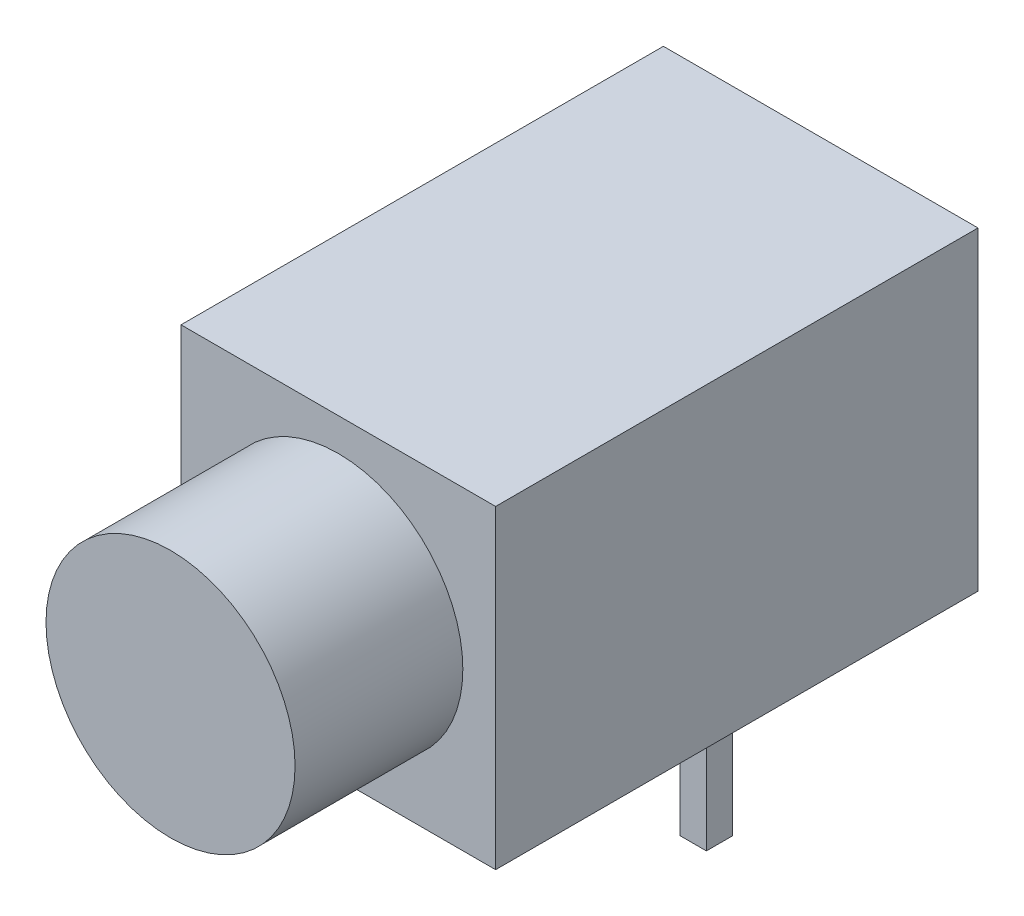
ISO-10303-21;
HEADER;
FILE_DESCRIPTION(('STEP AP214'),'2;1');
FILE_NAME('part.step','',(''),(''),'','','');
FILE_SCHEMA(('AUTOMOTIVE_DESIGN { 1 0 10303 214 1 1 1 1 }'));
ENDSEC;
DATA;
#1=APPLICATION_CONTEXT('core data for automotive mechanical design processes');
#2=APPLICATION_PROTOCOL_DEFINITION('international standard','automotive_design',2000,#1);
#3=PRODUCT_CONTEXT('',#1,'mechanical');
#4=PRODUCT('Part','Part','',(#3));
#5=PRODUCT_RELATED_PRODUCT_CATEGORY('part','',(#4));
#6=PRODUCT_DEFINITION_FORMATION('','',#4);
#7=PRODUCT_DEFINITION_CONTEXT('part definition',#1,'design');
#8=PRODUCT_DEFINITION('design','',#6,#7);
#9=PRODUCT_DEFINITION_SHAPE('','',#8);
#10=(LENGTH_UNIT() NAMED_UNIT(*) SI_UNIT(.MILLI.,.METRE.));
#11=(NAMED_UNIT(*) PLANE_ANGLE_UNIT() SI_UNIT($,.RADIAN.));
#12=(NAMED_UNIT(*) SI_UNIT($,.STERADIAN.) SOLID_ANGLE_UNIT());
#13=UNCERTAINTY_MEASURE_WITH_UNIT(LENGTH_MEASURE(1.E-05),#10,'distance_accuracy_value','');
#14=(GEOMETRIC_REPRESENTATION_CONTEXT(3) GLOBAL_UNCERTAINTY_ASSIGNED_CONTEXT((#13)) GLOBAL_UNIT_ASSIGNED_CONTEXT((#10,
#11,#12)) REPRESENTATION_CONTEXT('',''));
#15=CARTESIAN_POINT('',(0.,0.,0.));
#16=DIRECTION('',(0.,0.,1.));
#17=DIRECTION('',(1.,0.,0.));
#18=AXIS2_PLACEMENT_3D('',#15,#16,#17);
#19=CARTESIAN_POINT('',(0.,0.,0.));
#20=DIRECTION('',(0.,1.,0.));
#21=DIRECTION('',(0.,0.,1.));
#22=AXIS2_PLACEMENT_3D('',#19,#20,#21);
#23=PLANE('',#22);
#24=DIRECTION('',(0.,0.,-1.));
#25=VECTOR('',#24,1.);
#26=CARTESIAN_POINT('',(1.48,0.,-6.));
#27=LINE('',#26,#25);
#28=CARTESIAN_POINT('',(1.48,0.,-5.5));
#29=VERTEX_POINT('',#28);
#30=CARTESIAN_POINT('',(1.48,0.,-6.));
#31=VERTEX_POINT('',#30);
#32=EDGE_CURVE('E130',#29,#31,#27,.T.);
#33=ORIENTED_EDGE('',*,*,#32,.F.);
#34=DIRECTION('',(-1.,0.,0.));
#35=VECTOR('',#34,1.);
#36=CARTESIAN_POINT('',(1.48,0.,-5.5));
#37=LINE('',#36,#35);
#38=CARTESIAN_POINT('',(1.98,0.,-5.5));
#39=VERTEX_POINT('',#38);
#40=EDGE_CURVE('E163',#39,#29,#37,.T.);
#41=ORIENTED_EDGE('',*,*,#40,.F.);
#42=DIRECTION('',(0.,0.,1.));
#43=VECTOR('',#42,1.);
#44=CARTESIAN_POINT('',(1.98,0.,-6.));
#45=LINE('',#44,#43);
#46=CARTESIAN_POINT('',(1.98,0.,-6.));
#47=VERTEX_POINT('',#46);
#48=EDGE_CURVE('E175',#47,#39,#45,.T.);
#49=ORIENTED_EDGE('',*,*,#48,.F.);
#50=DIRECTION('',(1.,0.,0.));
#51=VECTOR('',#50,1.);
#52=CARTESIAN_POINT('',(1.48,0.,-6.));
#53=LINE('',#52,#51);
#54=EDGE_CURVE('E172',#31,#47,#53,.T.);
#55=ORIENTED_EDGE('',*,*,#54,.F.);
#56=EDGE_LOOP('',(#33,#41,#49,#55));
#57=FACE_BOUND('',#56,.T.);
#58=DIRECTION('',(1.,0.,0.));
#59=VECTOR('',#58,1.);
#60=CARTESIAN_POINT('',(0.,0.,-9.2));
#61=LINE('',#60,#59);
#62=CARTESIAN_POINT('',(0.,0.,-9.2));
#63=VERTEX_POINT('',#62);
#64=CARTESIAN_POINT('',(6.,0.,-9.2));
#65=VERTEX_POINT('',#64);
#66=EDGE_CURVE('E193',#63,#65,#61,.T.);
#67=ORIENTED_EDGE('',*,*,#66,.T.);
#68=DIRECTION('',(0.,0.,-1.));
#69=VECTOR('',#68,1.);
#70=CARTESIAN_POINT('',(6.,0.,0.));
#71=LINE('',#70,#69);
#72=CARTESIAN_POINT('',(6.,0.,0.));
#73=VERTEX_POINT('',#72);
#74=EDGE_CURVE('E208',#73,#65,#71,.T.);
#75=ORIENTED_EDGE('',*,*,#74,.F.);
#76=DIRECTION('',(1.,0.,0.));
#77=VECTOR('',#76,1.);
#78=CARTESIAN_POINT('',(0.,0.,0.));
#79=LINE('',#78,#77);
#80=CARTESIAN_POINT('',(0.,0.,0.));
#81=VERTEX_POINT('',#80);
#82=EDGE_CURVE('E211',#81,#73,#79,.T.);
#83=ORIENTED_EDGE('',*,*,#82,.F.);
#84=DIRECTION('',(0.,0.,-1.));
#85=VECTOR('',#84,1.);
#86=CARTESIAN_POINT('',(0.,0.,0.));
#87=LINE('',#86,#85);
#88=EDGE_CURVE('E199',#81,#63,#87,.T.);
#89=ORIENTED_EDGE('',*,*,#88,.T.);
#90=EDGE_LOOP('',(#67,#75,#83,#89));
#91=FACE_BOUND('',#90,.T.);
#92=DIRECTION('',(0.,0.,-1.));
#93=VECTOR('',#92,1.);
#94=CARTESIAN_POINT('',(4.02,0.,-6.));
#95=LINE('',#94,#93);
#96=CARTESIAN_POINT('',(4.02,0.,-5.5));
#97=VERTEX_POINT('',#96);
#98=CARTESIAN_POINT('',(4.02,0.,-6.));
#99=VERTEX_POINT('',#98);
#100=EDGE_CURVE('E124',#97,#99,#95,.T.);
#101=ORIENTED_EDGE('',*,*,#100,.F.);
#102=DIRECTION('',(-1.,0.,0.));
#103=VECTOR('',#102,1.);
#104=CARTESIAN_POINT('',(4.02,0.,-5.5));
#105=LINE('',#104,#103);
#106=CARTESIAN_POINT('',(4.52,0.,-5.5));
#107=VERTEX_POINT('',#106);
#108=EDGE_CURVE('E126',#107,#97,#105,.T.);
#109=ORIENTED_EDGE('',*,*,#108,.F.);
#110=DIRECTION('',(0.,0.,1.));
#111=VECTOR('',#110,1.);
#112=CARTESIAN_POINT('',(4.52,0.,-6.));
#113=LINE('',#112,#111);
#114=CARTESIAN_POINT('',(4.52,0.,-6.));
#115=VERTEX_POINT('',#114);
#116=EDGE_CURVE('E59',#115,#107,#113,.T.);
#117=ORIENTED_EDGE('',*,*,#116,.F.);
#118=DIRECTION('',(1.,0.,0.));
#119=VECTOR('',#118,1.);
#120=CARTESIAN_POINT('',(4.02,0.,-6.));
#121=LINE('',#120,#119);
#122=EDGE_CURVE('E54',#99,#115,#121,.T.);
#123=ORIENTED_EDGE('',*,*,#122,.F.);
#124=EDGE_LOOP('',(#101,#109,#117,#123));
#125=FACE_BOUND('',#124,.T.);
#126=ADVANCED_FACE('F37',(#57,#91,#125),#23,.F.);
#127=CARTESIAN_POINT('',(0.,6.,-9.2));
#128=DIRECTION('',(0.,0.,-1.));
#129=DIRECTION('',(-1.,0.,0.));
#130=AXIS2_PLACEMENT_3D('',#127,#128,#129);
#131=PLANE('',#130);
#132=ORIENTED_EDGE('',*,*,#66,.F.);
#133=DIRECTION('',(0.,-1.,0.));
#134=VECTOR('',#133,1.);
#135=CARTESIAN_POINT('',(0.,6.,-9.2));
#136=LINE('',#135,#134);
#137=CARTESIAN_POINT('',(0.,6.,-9.2));
#138=VERTEX_POINT('',#137);
#139=EDGE_CURVE('E46',#138,#63,#136,.T.);
#140=ORIENTED_EDGE('',*,*,#139,.F.);
#141=DIRECTION('',(1.,0.,0.));
#142=VECTOR('',#141,1.);
#143=CARTESIAN_POINT('',(0.,6.,-9.2));
#144=LINE('',#143,#142);
#145=CARTESIAN_POINT('',(6.,6.,-9.2));
#146=VERTEX_POINT('',#145);
#147=EDGE_CURVE('E195',#138,#146,#144,.T.);
#148=ORIENTED_EDGE('',*,*,#147,.T.);
#149=DIRECTION('',(0.,-1.,0.));
#150=VECTOR('',#149,1.);
#151=CARTESIAN_POINT('',(6.,6.,-9.2));
#152=LINE('',#151,#150);
#153=EDGE_CURVE('E41',#146,#65,#152,.T.);
#154=ORIENTED_EDGE('',*,*,#153,.T.);
#155=EDGE_LOOP('',(#132,#140,#148,#154));
#156=FACE_BOUND('',#155,.T.);
#157=ADVANCED_FACE('F39',(#156),#131,.T.);
#158=CARTESIAN_POINT('',(0.,6.,0.));
#159=DIRECTION('',(-1.,0.,0.));
#160=DIRECTION('',(0.,0.,1.));
#161=AXIS2_PLACEMENT_3D('',#158,#159,#160);
#162=PLANE('',#161);
#163=ORIENTED_EDGE('',*,*,#88,.F.);
#164=DIRECTION('',(0.,-1.,0.));
#165=VECTOR('',#164,1.);
#166=CARTESIAN_POINT('',(0.,6.,0.));
#167=LINE('',#166,#165);
#168=CARTESIAN_POINT('',(0.,6.,0.));
#169=VERTEX_POINT('',#168);
#170=EDGE_CURVE('E216',#169,#81,#167,.T.);
#171=ORIENTED_EDGE('',*,*,#170,.F.);
#172=DIRECTION('',(0.,0.,-1.));
#173=VECTOR('',#172,1.);
#174=CARTESIAN_POINT('',(0.,6.,0.));
#175=LINE('',#174,#173);
#176=EDGE_CURVE('E203',#169,#138,#175,.T.);
#177=ORIENTED_EDGE('',*,*,#176,.T.);
#178=ORIENTED_EDGE('',*,*,#139,.T.);
#179=EDGE_LOOP('',(#163,#171,#177,#178));
#180=FACE_BOUND('',#179,.T.);
#181=ADVANCED_FACE('F232',(#180),#162,.T.);
#182=CARTESIAN_POINT('',(0.,6.,0.));
#183=DIRECTION('',(0.,0.,-1.));
#184=DIRECTION('',(-1.,0.,0.));
#185=AXIS2_PLACEMENT_3D('',#182,#183,#184);
#186=PLANE('',#185);
#187=CARTESIAN_POINT('',(3.,3.,0.));
#188=DIRECTION('',(0.,0.,1.));
#189=DIRECTION('',(1.,0.,0.));
#190=AXIS2_PLACEMENT_3D('',#187,#188,#189);
#191=CIRCLE('',#190,2.375);
#192=CARTESIAN_POINT('',(5.375,3.,0.));
#193=VERTEX_POINT('',#192);
#194=EDGE_CURVE('E11',#193,#193,#191,.T.);
#195=ORIENTED_EDGE('',*,*,#194,.F.);
#196=EDGE_LOOP('',(#195));
#197=FACE_BOUND('',#196,.T.);
#198=ORIENTED_EDGE('',*,*,#82,.T.);
#199=DIRECTION('',(0.,-1.,0.));
#200=VECTOR('',#199,1.);
#201=CARTESIAN_POINT('',(6.,6.,0.));
#202=LINE('',#201,#200);
#203=CARTESIAN_POINT('',(6.,6.,0.));
#204=VERTEX_POINT('',#203);
#205=EDGE_CURVE('E217',#204,#73,#202,.T.);
#206=ORIENTED_EDGE('',*,*,#205,.F.);
#207=DIRECTION('',(1.,0.,0.));
#208=VECTOR('',#207,1.);
#209=CARTESIAN_POINT('',(0.,6.,0.));
#210=LINE('',#209,#208);
#211=EDGE_CURVE('E201',#169,#204,#210,.T.);
#212=ORIENTED_EDGE('',*,*,#211,.F.);
#213=ORIENTED_EDGE('',*,*,#170,.T.);
#214=EDGE_LOOP('',(#198,#206,#212,#213));
#215=FACE_BOUND('',#214,.T.);
#216=ADVANCED_FACE('F238',(#197,#215),#186,.F.);
#217=CARTESIAN_POINT('',(6.,6.,0.));
#218=DIRECTION('',(-1.,0.,0.));
#219=DIRECTION('',(0.,0.,1.));
#220=AXIS2_PLACEMENT_3D('',#217,#218,#219);
#221=PLANE('',#220);
#222=ORIENTED_EDGE('',*,*,#74,.T.);
#223=ORIENTED_EDGE('',*,*,#153,.F.);
#224=DIRECTION('',(0.,0.,-1.));
#225=VECTOR('',#224,1.);
#226=CARTESIAN_POINT('',(6.,6.,0.));
#227=LINE('',#226,#225);
#228=EDGE_CURVE('E198',#204,#146,#227,.T.);
#229=ORIENTED_EDGE('',*,*,#228,.F.);
#230=ORIENTED_EDGE('',*,*,#205,.T.);
#231=EDGE_LOOP('',(#222,#223,#229,#230));
#232=FACE_BOUND('',#231,.T.);
#233=ADVANCED_FACE('F227',(#232),#221,.F.);
#234=CARTESIAN_POINT('',(0.,6.,0.));
#235=DIRECTION('',(0.,1.,0.));
#236=DIRECTION('',(0.,0.,1.));
#237=AXIS2_PLACEMENT_3D('',#234,#235,#236);
#238=PLANE('',#237);
#239=ORIENTED_EDGE('',*,*,#147,.F.);
#240=ORIENTED_EDGE('',*,*,#176,.F.);
#241=ORIENTED_EDGE('',*,*,#211,.T.);
#242=ORIENTED_EDGE('',*,*,#228,.T.);
#243=EDGE_LOOP('',(#239,#240,#241,#242));
#244=FACE_BOUND('',#243,.T.);
#245=ADVANCED_FACE('F236',(#244),#238,.T.);
#246=CARTESIAN_POINT('',(3.,3.,3.2));
#247=DIRECTION('',(0.,0.,-1.));
#248=DIRECTION('',(-1.,0.,0.));
#249=AXIS2_PLACEMENT_3D('',#246,#247,#248);
#250=CYLINDRICAL_SURFACE('',#249,2.375);
#251=CARTESIAN_POINT('',(3.,3.,3.2));
#252=DIRECTION('',(0.,0.,1.));
#253=DIRECTION('',(1.,0.,0.));
#254=AXIS2_PLACEMENT_3D('',#251,#252,#253);
#255=CIRCLE('',#254,2.375);
#256=CARTESIAN_POINT('',(5.375,3.,3.2));
#257=VERTEX_POINT('',#256);
#258=EDGE_CURVE('E191',#257,#257,#255,.T.);
#259=ORIENTED_EDGE('',*,*,#258,.F.);
#260=EDGE_LOOP('',(#259));
#261=FACE_BOUND('',#260,.T.);
#262=ORIENTED_EDGE('',*,*,#194,.T.);
#263=EDGE_LOOP('',(#262));
#264=FACE_BOUND('',#263,.T.);
#265=ADVANCED_FACE('F257',(#261,#264),#250,.T.);
#266=CARTESIAN_POINT('',(3.,3.,3.2));
#267=DIRECTION('',(0.,0.,1.));
#268=DIRECTION('',(1.,0.,0.));
#269=AXIS2_PLACEMENT_3D('',#266,#267,#268);
#270=PLANE('',#269);
#271=ORIENTED_EDGE('',*,*,#258,.T.);
#272=EDGE_LOOP('',(#271));
#273=FACE_BOUND('',#272,.T.);
#274=ADVANCED_FACE('F260',(#273),#270,.T.);
#275=CARTESIAN_POINT('',(1.48,-3.18,-6.));
#276=DIRECTION('',(1.,0.,0.));
#277=DIRECTION('',(0.,0.,-1.));
#278=AXIS2_PLACEMENT_3D('',#275,#276,#277);
#279=PLANE('',#278);
#280=ORIENTED_EDGE('',*,*,#32,.T.);
#281=DIRECTION('',(0.,1.,0.));
#282=VECTOR('',#281,1.);
#283=CARTESIAN_POINT('',(1.48,-3.18,-6.));
#284=LINE('',#283,#282);
#285=CARTESIAN_POINT('',(1.48,-3.18,-6.));
#286=VERTEX_POINT('',#285);
#287=EDGE_CURVE('E188',#286,#31,#284,.T.);
#288=ORIENTED_EDGE('',*,*,#287,.F.);
#289=DIRECTION('',(0.,0.,-1.));
#290=VECTOR('',#289,1.);
#291=CARTESIAN_POINT('',(1.48,-3.18,-6.));
#292=LINE('',#291,#290);
#293=CARTESIAN_POINT('',(1.48,-3.18,-5.5));
#294=VERTEX_POINT('',#293);
#295=EDGE_CURVE('E159',#294,#286,#292,.T.);
#296=ORIENTED_EDGE('',*,*,#295,.F.);
#297=DIRECTION('',(0.,1.,0.));
#298=VECTOR('',#297,1.);
#299=CARTESIAN_POINT('',(1.48,-3.18,-5.5));
#300=LINE('',#299,#298);
#301=EDGE_CURVE('E169',#294,#29,#300,.T.);
#302=ORIENTED_EDGE('',*,*,#301,.T.);
#303=EDGE_LOOP('',(#280,#288,#296,#302));
#304=FACE_BOUND('',#303,.T.);
#305=ADVANCED_FACE('F264',(#304),#279,.F.);
#306=CARTESIAN_POINT('',(1.48,-3.18,-6.));
#307=DIRECTION('',(0.,0.,1.));
#308=DIRECTION('',(1.,0.,0.));
#309=AXIS2_PLACEMENT_3D('',#306,#307,#308);
#310=PLANE('',#309);
#311=ORIENTED_EDGE('',*,*,#54,.T.);
#312=DIRECTION('',(0.,1.,0.));
#313=VECTOR('',#312,1.);
#314=CARTESIAN_POINT('',(1.98,-3.18,-6.));
#315=LINE('',#314,#313);
#316=CARTESIAN_POINT('',(1.98,-3.18,-6.));
#317=VERTEX_POINT('',#316);
#318=EDGE_CURVE('E185',#317,#47,#315,.T.);
#319=ORIENTED_EDGE('',*,*,#318,.F.);
#320=DIRECTION('',(1.,0.,0.));
#321=VECTOR('',#320,1.);
#322=CARTESIAN_POINT('',(1.48,-3.18,-6.));
#323=LINE('',#322,#321);
#324=EDGE_CURVE('E162',#286,#317,#323,.T.);
#325=ORIENTED_EDGE('',*,*,#324,.F.);
#326=ORIENTED_EDGE('',*,*,#287,.T.);
#327=EDGE_LOOP('',(#311,#319,#325,#326));
#328=FACE_BOUND('',#327,.T.);
#329=ADVANCED_FACE('F268',(#328),#310,.F.);
#330=CARTESIAN_POINT('',(1.98,-3.18,-6.));
#331=DIRECTION('',(-1.,0.,0.));
#332=DIRECTION('',(0.,0.,1.));
#333=AXIS2_PLACEMENT_3D('',#330,#331,#332);
#334=PLANE('',#333);
#335=ORIENTED_EDGE('',*,*,#48,.T.);
#336=DIRECTION('',(0.,1.,0.));
#337=VECTOR('',#336,1.);
#338=CARTESIAN_POINT('',(1.98,-3.18,-5.5));
#339=LINE('',#338,#337);
#340=CARTESIAN_POINT('',(1.98,-3.18,-5.5));
#341=VERTEX_POINT('',#340);
#342=EDGE_CURVE('E182',#341,#39,#339,.T.);
#343=ORIENTED_EDGE('',*,*,#342,.F.);
#344=DIRECTION('',(0.,0.,1.));
#345=VECTOR('',#344,1.);
#346=CARTESIAN_POINT('',(1.98,-3.18,-6.));
#347=LINE('',#346,#345);
#348=EDGE_CURVE('E165',#317,#341,#347,.T.);
#349=ORIENTED_EDGE('',*,*,#348,.F.);
#350=ORIENTED_EDGE('',*,*,#318,.T.);
#351=EDGE_LOOP('',(#335,#343,#349,#350));
#352=FACE_BOUND('',#351,.T.);
#353=ADVANCED_FACE('F272',(#352),#334,.F.);
#354=CARTESIAN_POINT('',(1.48,-3.18,-5.5));
#355=DIRECTION('',(0.,0.,-1.));
#356=DIRECTION('',(-1.,0.,0.));
#357=AXIS2_PLACEMENT_3D('',#354,#355,#356);
#358=PLANE('',#357);
#359=ORIENTED_EDGE('',*,*,#40,.T.);
#360=ORIENTED_EDGE('',*,*,#301,.F.);
#361=DIRECTION('',(-1.,0.,0.));
#362=VECTOR('',#361,1.);
#363=CARTESIAN_POINT('',(1.48,-3.18,-5.5));
#364=LINE('',#363,#362);
#365=EDGE_CURVE('E167',#341,#294,#364,.T.);
#366=ORIENTED_EDGE('',*,*,#365,.F.);
#367=ORIENTED_EDGE('',*,*,#342,.T.);
#368=EDGE_LOOP('',(#359,#360,#366,#367));
#369=FACE_BOUND('',#368,.T.);
#370=ADVANCED_FACE('F276',(#369),#358,.F.);
#371=CARTESIAN_POINT('',(0.,-3.18,0.));
#372=DIRECTION('',(0.,1.,0.));
#373=DIRECTION('',(0.,0.,1.));
#374=AXIS2_PLACEMENT_3D('',#371,#372,#373);
#375=PLANE('',#374);
#376=ORIENTED_EDGE('',*,*,#295,.T.);
#377=ORIENTED_EDGE('',*,*,#324,.T.);
#378=ORIENTED_EDGE('',*,*,#348,.T.);
#379=ORIENTED_EDGE('',*,*,#365,.T.);
#380=EDGE_LOOP('',(#376,#377,#378,#379));
#381=FACE_BOUND('',#380,.T.);
#382=ADVANCED_FACE('F280',(#381),#375,.F.);
#383=CARTESIAN_POINT('',(4.02,-3.18,-6.));
#384=DIRECTION('',(1.,0.,0.));
#385=DIRECTION('',(0.,0.,-1.));
#386=AXIS2_PLACEMENT_3D('',#383,#384,#385);
#387=PLANE('',#386);
#388=ORIENTED_EDGE('',*,*,#100,.T.);
#389=DIRECTION('',(0.,1.,0.));
#390=VECTOR('',#389,1.);
#391=CARTESIAN_POINT('',(4.02,-3.18,-6.));
#392=LINE('',#391,#390);
#393=CARTESIAN_POINT('',(4.02,-3.18,-6.));
#394=VERTEX_POINT('',#393);
#395=EDGE_CURVE('E443',#394,#99,#392,.T.);
#396=ORIENTED_EDGE('',*,*,#395,.F.);
#397=DIRECTION('',(0.,0.,-1.));
#398=VECTOR('',#397,1.);
#399=CARTESIAN_POINT('',(4.02,-3.18,-6.));
#400=LINE('',#399,#398);
#401=CARTESIAN_POINT('',(4.02,-3.18,-5.5));
#402=VERTEX_POINT('',#401);
#403=EDGE_CURVE('E141',#402,#394,#400,.T.);
#404=ORIENTED_EDGE('',*,*,#403,.F.);
#405=DIRECTION('',(0.,1.,0.));
#406=VECTOR('',#405,1.);
#407=CARTESIAN_POINT('',(4.02,-3.18,-5.5));
#408=LINE('',#407,#406);
#409=EDGE_CURVE('E137',#402,#97,#408,.T.);
#410=ORIENTED_EDGE('',*,*,#409,.T.);
#411=EDGE_LOOP('',(#388,#396,#404,#410));
#412=FACE_BOUND('',#411,.T.);
#413=ADVANCED_FACE('F143',(#412),#387,.F.);
#414=CARTESIAN_POINT('',(4.02,-3.18,-6.));
#415=DIRECTION('',(0.,0.,1.));
#416=DIRECTION('',(1.,0.,0.));
#417=AXIS2_PLACEMENT_3D('',#414,#415,#416);
#418=PLANE('',#417);
#419=ORIENTED_EDGE('',*,*,#122,.T.);
#420=DIRECTION('',(0.,1.,0.));
#421=VECTOR('',#420,1.);
#422=CARTESIAN_POINT('',(4.52,-3.18,-6.));
#423=LINE('',#422,#421);
#424=CARTESIAN_POINT('',(4.52,-3.18,-6.));
#425=VERTEX_POINT('',#424);
#426=EDGE_CURVE('E149',#425,#115,#423,.T.);
#427=ORIENTED_EDGE('',*,*,#426,.F.);
#428=DIRECTION('',(1.,0.,0.));
#429=VECTOR('',#428,1.);
#430=CARTESIAN_POINT('',(4.02,-3.18,-6.));
#431=LINE('',#430,#429);
#432=EDGE_CURVE('E156',#394,#425,#431,.T.);
#433=ORIENTED_EDGE('',*,*,#432,.F.);
#434=ORIENTED_EDGE('',*,*,#395,.T.);
#435=EDGE_LOOP('',(#419,#427,#433,#434));
#436=FACE_BOUND('',#435,.T.);
#437=ADVANCED_FACE('F294',(#436),#418,.F.);
#438=CARTESIAN_POINT('',(4.52,-3.18,-6.));
#439=DIRECTION('',(-1.,0.,0.));
#440=DIRECTION('',(0.,0.,1.));
#441=AXIS2_PLACEMENT_3D('',#438,#439,#440);
#442=PLANE('',#441);
#443=ORIENTED_EDGE('',*,*,#116,.T.);
#444=DIRECTION('',(0.,1.,0.));
#445=VECTOR('',#444,1.);
#446=CARTESIAN_POINT('',(4.52,-3.18,-5.5));
#447=LINE('',#446,#445);
#448=CARTESIAN_POINT('',(4.52,-3.18,-5.5));
#449=VERTEX_POINT('',#448);
#450=EDGE_CURVE('E140',#449,#107,#447,.T.);
#451=ORIENTED_EDGE('',*,*,#450,.F.);
#452=DIRECTION('',(0.,0.,1.));
#453=VECTOR('',#452,1.);
#454=CARTESIAN_POINT('',(4.52,-3.18,-6.));
#455=LINE('',#454,#453);
#456=EDGE_CURVE('E147',#425,#449,#455,.T.);
#457=ORIENTED_EDGE('',*,*,#456,.F.);
#458=ORIENTED_EDGE('',*,*,#426,.T.);
#459=EDGE_LOOP('',(#443,#451,#457,#458));
#460=FACE_BOUND('',#459,.T.);
#461=ADVANCED_FACE('F291',(#460),#442,.F.);
#462=CARTESIAN_POINT('',(4.02,-3.18,-5.5));
#463=DIRECTION('',(0.,0.,-1.));
#464=DIRECTION('',(-1.,0.,0.));
#465=AXIS2_PLACEMENT_3D('',#462,#463,#464);
#466=PLANE('',#465);
#467=ORIENTED_EDGE('',*,*,#108,.T.);
#468=ORIENTED_EDGE('',*,*,#409,.F.);
#469=DIRECTION('',(-1.,0.,0.));
#470=VECTOR('',#469,1.);
#471=CARTESIAN_POINT('',(4.02,-3.18,-5.5));
#472=LINE('',#471,#470);
#473=EDGE_CURVE('E145',#449,#402,#472,.T.);
#474=ORIENTED_EDGE('',*,*,#473,.F.);
#475=ORIENTED_EDGE('',*,*,#450,.T.);
#476=EDGE_LOOP('',(#467,#468,#474,#475));
#477=FACE_BOUND('',#476,.T.);
#478=ADVANCED_FACE('F135',(#477),#466,.F.);
#479=CARTESIAN_POINT('',(0.,-3.18,0.));
#480=DIRECTION('',(0.,1.,0.));
#481=DIRECTION('',(0.,0.,1.));
#482=AXIS2_PLACEMENT_3D('',#479,#480,#481);
#483=PLANE('',#482);
#484=ORIENTED_EDGE('',*,*,#403,.T.);
#485=ORIENTED_EDGE('',*,*,#432,.T.);
#486=ORIENTED_EDGE('',*,*,#456,.T.);
#487=ORIENTED_EDGE('',*,*,#473,.T.);
#488=EDGE_LOOP('',(#484,#485,#486,#487));
#489=FACE_BOUND('',#488,.T.);
#490=ADVANCED_FACE('F285',(#489),#483,.F.);
#491=CLOSED_SHELL('',(#126,#157,#181,#216,#233,#245,#265,#274,#305,#329,#353,#370,#382,#413,
#437,#461,#478,#490));
#492=MANIFOLD_SOLID_BREP('B2',#491);
#493=ADVANCED_BREP_SHAPE_REPRESENTATION('',(#18,#492),#14);
#494=SHAPE_DEFINITION_REPRESENTATION(#9,#493);
ENDSEC;
END-ISO-10303-21;
